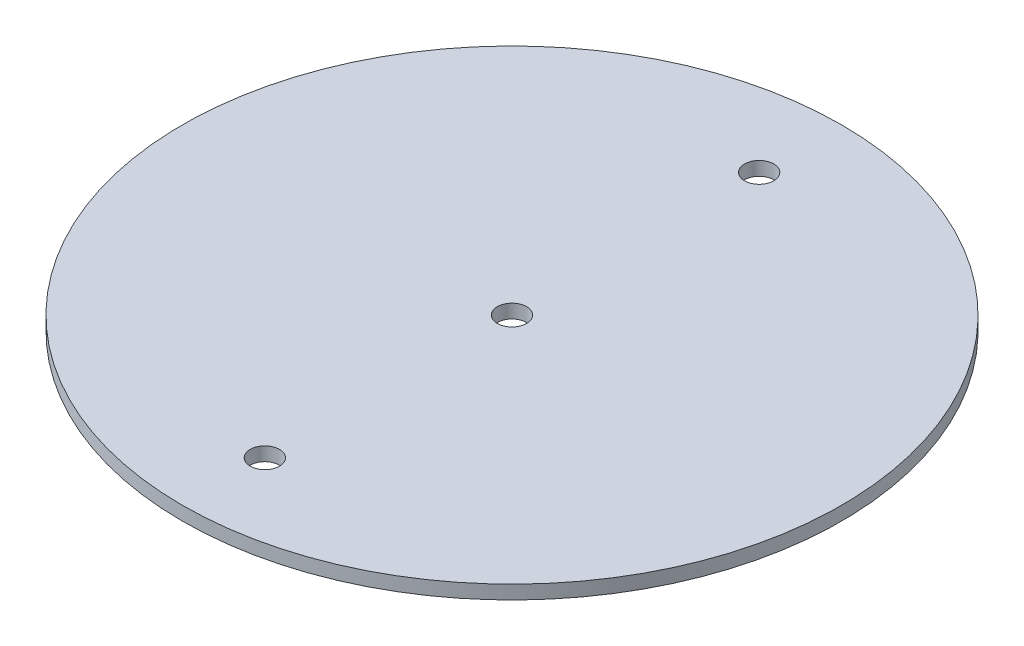
ISO-10303-21;
HEADER;
FILE_DESCRIPTION(('STEP AP214'),'2;1');
FILE_NAME('part.step','',(''),(''),'','','');
FILE_SCHEMA(('AUTOMOTIVE_DESIGN { 1 0 10303 214 1 1 1 1 }'));
ENDSEC;
DATA;
#1=APPLICATION_CONTEXT('core data for automotive mechanical design processes');
#2=APPLICATION_PROTOCOL_DEFINITION('international standard','automotive_design',2000,#1);
#3=PRODUCT_CONTEXT('',#1,'mechanical');
#4=PRODUCT('Part','Part','',(#3));
#5=PRODUCT_RELATED_PRODUCT_CATEGORY('part','',(#4));
#6=PRODUCT_DEFINITION_FORMATION('','',#4);
#7=PRODUCT_DEFINITION_CONTEXT('part definition',#1,'design');
#8=PRODUCT_DEFINITION('design','',#6,#7);
#9=PRODUCT_DEFINITION_SHAPE('','',#8);
#10=(LENGTH_UNIT() NAMED_UNIT(*) SI_UNIT(.MILLI.,.METRE.));
#11=(NAMED_UNIT(*) PLANE_ANGLE_UNIT() SI_UNIT($,.RADIAN.));
#12=(NAMED_UNIT(*) SI_UNIT($,.STERADIAN.) SOLID_ANGLE_UNIT());
#13=UNCERTAINTY_MEASURE_WITH_UNIT(LENGTH_MEASURE(1.E-05),#10,'distance_accuracy_value','');
#14=(GEOMETRIC_REPRESENTATION_CONTEXT(3) GLOBAL_UNCERTAINTY_ASSIGNED_CONTEXT((#13)) GLOBAL_UNIT_ASSIGNED_CONTEXT((#10,
#11,#12)) REPRESENTATION_CONTEXT('',''));
#15=CARTESIAN_POINT('',(0.,0.,0.));
#16=DIRECTION('',(0.,0.,1.));
#17=DIRECTION('',(1.,0.,0.));
#18=AXIS2_PLACEMENT_3D('',#15,#16,#17);
#19=CARTESIAN_POINT('',(0.,3.175,0.));
#20=DIRECTION('',(0.,-1.,0.));
#21=DIRECTION('',(0.,0.,-1.));
#22=AXIS2_PLACEMENT_3D('',#19,#20,#21);
#23=CYLINDRICAL_SURFACE('',#22,76.2);
#24=CARTESIAN_POINT('',(0.,3.175,0.));
#25=DIRECTION('',(0.,1.,0.));
#26=DIRECTION('',(0.,0.,1.));
#27=AXIS2_PLACEMENT_3D('',#24,#25,#26);
#28=CIRCLE('',#27,76.2);
#29=CARTESIAN_POINT('',(0.,3.175,76.2));
#30=VERTEX_POINT('',#29);
#31=EDGE_CURVE('E10',#30,#30,#28,.T.);
#32=ORIENTED_EDGE('',*,*,#31,.F.);
#33=EDGE_LOOP('',(#32));
#34=FACE_BOUND('',#33,.T.);
#35=CARTESIAN_POINT('',(0.,0.,0.));
#36=DIRECTION('',(0.,1.,0.));
#37=DIRECTION('',(0.,0.,1.));
#38=AXIS2_PLACEMENT_3D('',#35,#36,#37);
#39=CIRCLE('',#38,76.2);
#40=CARTESIAN_POINT('',(0.,0.,76.2));
#41=VERTEX_POINT('',#40);
#42=EDGE_CURVE('E34',#41,#41,#39,.T.);
#43=ORIENTED_EDGE('',*,*,#42,.T.);
#44=EDGE_LOOP('',(#43));
#45=FACE_BOUND('',#44,.T.);
#46=ADVANCED_FACE('F31',(#34,#45),#23,.T.);
#47=CARTESIAN_POINT('',(0.,3.175,0.));
#48=DIRECTION('',(0.,1.,0.));
#49=DIRECTION('',(0.,0.,1.));
#50=AXIS2_PLACEMENT_3D('',#47,#48,#49);
#51=PLANE('',#50);
#52=CARTESIAN_POINT('',(0.,3.175,0.));
#53=DIRECTION('',(0.,1.,0.));
#54=DIRECTION('',(0.,0.,1.));
#55=AXIS2_PLACEMENT_3D('',#52,#53,#54);
#56=CIRCLE('',#55,3.37819999999999);
#57=CARTESIAN_POINT('',(0.,3.175,3.37819999999999));
#58=VERTEX_POINT('',#57);
#59=EDGE_CURVE('E57',#58,#58,#56,.T.);
#60=ORIENTED_EDGE('',*,*,#59,.F.);
#61=EDGE_LOOP('',(#60));
#62=FACE_BOUND('',#61,.T.);
#63=CARTESIAN_POINT('',(0.,3.175,-57.15));
#64=DIRECTION('',(0.,1.,0.));
#65=DIRECTION('',(0.,0.,1.));
#66=AXIS2_PLACEMENT_3D('',#63,#64,#65);
#67=CIRCLE('',#66,3.37819999999999);
#68=CARTESIAN_POINT('',(0.,3.175,-53.7718));
#69=VERTEX_POINT('',#68);
#70=EDGE_CURVE('E51',#69,#69,#67,.T.);
#71=ORIENTED_EDGE('',*,*,#70,.F.);
#72=EDGE_LOOP('',(#71));
#73=FACE_BOUND('',#72,.T.);
#74=CARTESIAN_POINT('',(0.,3.175,57.15));
#75=DIRECTION('',(0.,1.,0.));
#76=DIRECTION('',(0.,0.,1.));
#77=AXIS2_PLACEMENT_3D('',#74,#75,#76);
#78=CIRCLE('',#77,3.37819999999999);
#79=CARTESIAN_POINT('',(0.,3.175,60.5282));
#80=VERTEX_POINT('',#79);
#81=EDGE_CURVE('E45',#80,#80,#78,.T.);
#82=ORIENTED_EDGE('',*,*,#81,.F.);
#83=EDGE_LOOP('',(#82));
#84=FACE_BOUND('',#83,.T.);
#85=ORIENTED_EDGE('',*,*,#31,.T.);
#86=EDGE_LOOP('',(#85));
#87=FACE_BOUND('',#86,.T.);
#88=ADVANCED_FACE('F63',(#62,#73,#84,#87),#51,.T.);
#89=CARTESIAN_POINT('',(0.,0.,0.));
#90=DIRECTION('',(0.,1.,0.));
#91=DIRECTION('',(0.,0.,1.));
#92=AXIS2_PLACEMENT_3D('',#89,#90,#91);
#93=PLANE('',#92);
#94=CARTESIAN_POINT('',(0.,0.,0.));
#95=DIRECTION('',(0.,1.,0.));
#96=DIRECTION('',(0.,0.,1.));
#97=AXIS2_PLACEMENT_3D('',#94,#95,#96);
#98=CIRCLE('',#97,3.3782);
#99=CARTESIAN_POINT('',(0.,0.,3.3782));
#100=VERTEX_POINT('',#99);
#101=EDGE_CURVE('E54',#100,#100,#98,.T.);
#102=ORIENTED_EDGE('',*,*,#101,.T.);
#103=EDGE_LOOP('',(#102));
#104=FACE_BOUND('',#103,.T.);
#105=CARTESIAN_POINT('',(0.,0.,-57.15));
#106=DIRECTION('',(0.,1.,0.));
#107=DIRECTION('',(0.,0.,1.));
#108=AXIS2_PLACEMENT_3D('',#105,#106,#107);
#109=CIRCLE('',#108,3.3782);
#110=CARTESIAN_POINT('',(0.,0.,-53.7718));
#111=VERTEX_POINT('',#110);
#112=EDGE_CURVE('E48',#111,#111,#109,.T.);
#113=ORIENTED_EDGE('',*,*,#112,.T.);
#114=EDGE_LOOP('',(#113));
#115=FACE_BOUND('',#114,.T.);
#116=CARTESIAN_POINT('',(0.,0.,57.15));
#117=DIRECTION('',(0.,1.,0.));
#118=DIRECTION('',(0.,0.,1.));
#119=AXIS2_PLACEMENT_3D('',#116,#117,#118);
#120=CIRCLE('',#119,3.3782);
#121=CARTESIAN_POINT('',(0.,0.,60.5282));
#122=VERTEX_POINT('',#121);
#123=EDGE_CURVE('E41',#122,#122,#120,.T.);
#124=ORIENTED_EDGE('',*,*,#123,.T.);
#125=EDGE_LOOP('',(#124));
#126=FACE_BOUND('',#125,.T.);
#127=ORIENTED_EDGE('',*,*,#42,.F.);
#128=EDGE_LOOP('',(#127));
#129=FACE_BOUND('',#128,.T.);
#130=ADVANCED_FACE('F66',(#104,#115,#126,#129),#93,.F.);
#131=CARTESIAN_POINT('',(0.,3.175,57.15));
#132=DIRECTION('',(0.,1.,0.));
#133=DIRECTION('',(0.,0.,1.));
#134=AXIS2_PLACEMENT_3D('',#131,#132,#133);
#135=CYLINDRICAL_SURFACE('',#134,3.37819999999999);
#136=ORIENTED_EDGE('',*,*,#123,.F.);
#137=EDGE_LOOP('',(#136));
#138=FACE_BOUND('',#137,.T.);
#139=ORIENTED_EDGE('',*,*,#81,.T.);
#140=EDGE_LOOP('',(#139));
#141=FACE_BOUND('',#140,.T.);
#142=ADVANCED_FACE('F72',(#138,#141),#135,.F.);
#143=CARTESIAN_POINT('',(0.,3.175,-57.15));
#144=DIRECTION('',(0.,1.,0.));
#145=DIRECTION('',(0.,0.,1.));
#146=AXIS2_PLACEMENT_3D('',#143,#144,#145);
#147=CYLINDRICAL_SURFACE('',#146,3.37819999999999);
#148=ORIENTED_EDGE('',*,*,#112,.F.);
#149=EDGE_LOOP('',(#148));
#150=FACE_BOUND('',#149,.T.);
#151=ORIENTED_EDGE('',*,*,#70,.T.);
#152=EDGE_LOOP('',(#151));
#153=FACE_BOUND('',#152,.T.);
#154=ADVANCED_FACE('F74',(#150,#153),#147,.F.);
#155=CARTESIAN_POINT('',(0.,3.175,0.));
#156=DIRECTION('',(0.,1.,0.));
#157=DIRECTION('',(0.,0.,1.));
#158=AXIS2_PLACEMENT_3D('',#155,#156,#157);
#159=CYLINDRICAL_SURFACE('',#158,3.37819999999999);
#160=ORIENTED_EDGE('',*,*,#101,.F.);
#161=EDGE_LOOP('',(#160));
#162=FACE_BOUND('',#161,.T.);
#163=ORIENTED_EDGE('',*,*,#59,.T.);
#164=EDGE_LOOP('',(#163));
#165=FACE_BOUND('',#164,.T.);
#166=ADVANCED_FACE('F61',(#162,#165),#159,.F.);
#167=CLOSED_SHELL('',(#46,#88,#130,#142,#154,#166));
#168=MANIFOLD_SOLID_BREP('B2',#167);
#169=ADVANCED_BREP_SHAPE_REPRESENTATION('',(#18,#168),#14);
#170=SHAPE_DEFINITION_REPRESENTATION(#9,#169);
ENDSEC;
END-ISO-10303-21;
